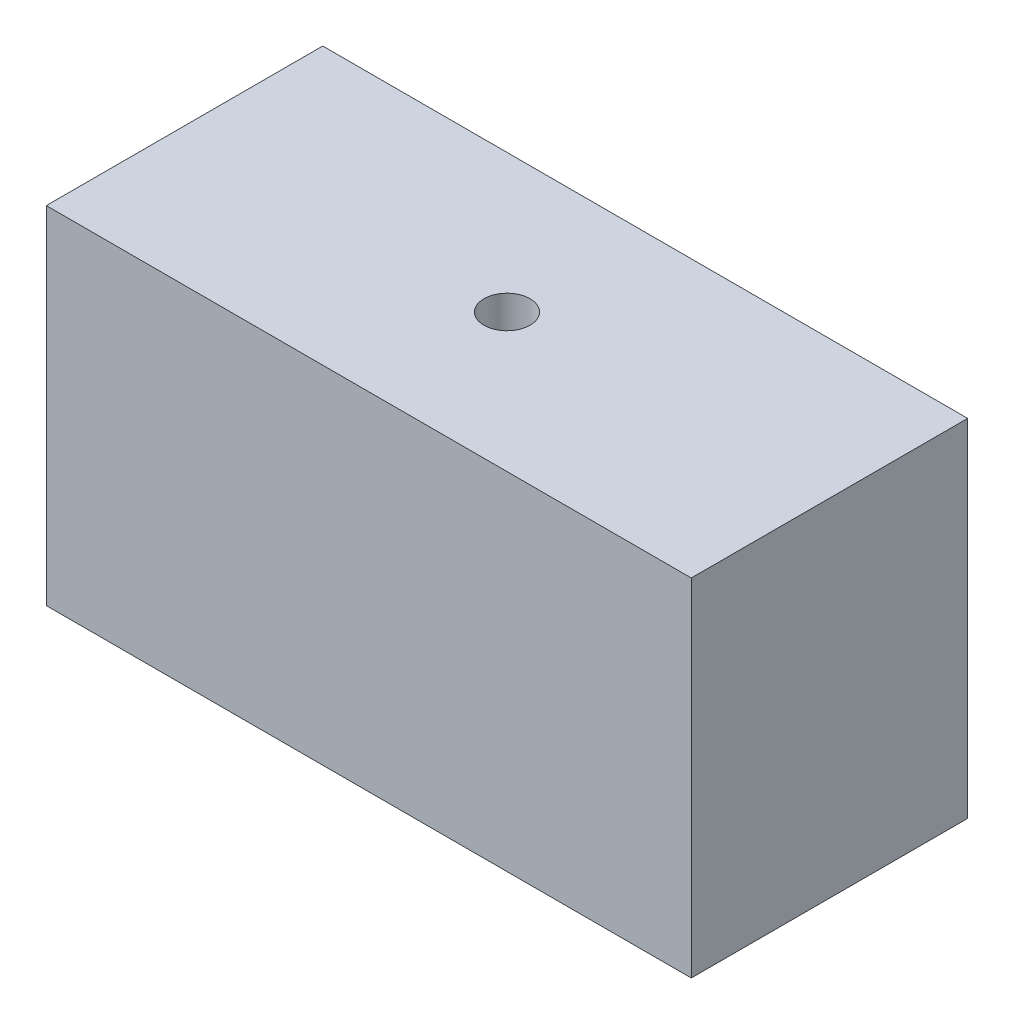
ISO-10303-21;
HEADER;
FILE_DESCRIPTION(('STEP AP214'),'2;1');
FILE_NAME('part.step','',(''),(''),'','','');
FILE_SCHEMA(('AUTOMOTIVE_DESIGN { 1 0 10303 214 1 1 1 1 }'));
ENDSEC;
DATA;
#1=APPLICATION_CONTEXT('core data for automotive mechanical design processes');
#2=APPLICATION_PROTOCOL_DEFINITION('international standard','automotive_design',2000,#1);
#3=PRODUCT_CONTEXT('',#1,'mechanical');
#4=PRODUCT('Part','Part','',(#3));
#5=PRODUCT_RELATED_PRODUCT_CATEGORY('part','',(#4));
#6=PRODUCT_DEFINITION_FORMATION('','',#4);
#7=PRODUCT_DEFINITION_CONTEXT('part definition',#1,'design');
#8=PRODUCT_DEFINITION('design','',#6,#7);
#9=PRODUCT_DEFINITION_SHAPE('','',#8);
#10=(LENGTH_UNIT() NAMED_UNIT(*) SI_UNIT(.MILLI.,.METRE.));
#11=(NAMED_UNIT(*) PLANE_ANGLE_UNIT() SI_UNIT($,.RADIAN.));
#12=(NAMED_UNIT(*) SI_UNIT($,.STERADIAN.) SOLID_ANGLE_UNIT());
#13=UNCERTAINTY_MEASURE_WITH_UNIT(LENGTH_MEASURE(1.E-05),#10,'distance_accuracy_value','');
#14=(GEOMETRIC_REPRESENTATION_CONTEXT(3) GLOBAL_UNCERTAINTY_ASSIGNED_CONTEXT((#13)) GLOBAL_UNIT_ASSIGNED_CONTEXT((#10,
#11,#12)) REPRESENTATION_CONTEXT('',''));
#15=CARTESIAN_POINT('',(0.,0.,0.));
#16=DIRECTION('',(0.,0.,1.));
#17=DIRECTION('',(1.,0.,0.));
#18=AXIS2_PLACEMENT_3D('',#15,#16,#17);
#19=CARTESIAN_POINT('',(0.,47.752,0.));
#20=DIRECTION('',(0.,-1.,0.));
#21=DIRECTION('',(0.,0.,-1.));
#22=AXIS2_PLACEMENT_3D('',#19,#20,#21);
#23=PLANE('',#22);
#24=DIRECTION('',(0.,0.,1.));
#25=VECTOR('',#24,1.);
#26=CARTESIAN_POINT('',(0.,47.752,0.));
#27=LINE('',#26,#25);
#28=CARTESIAN_POINT('',(0.,47.752,-38.1));
#29=VERTEX_POINT('',#28);
#30=CARTESIAN_POINT('',(0.,47.752,0.));
#31=VERTEX_POINT('',#30);
#32=EDGE_CURVE('E92',#29,#31,#27,.T.);
#33=ORIENTED_EDGE('',*,*,#32,.T.);
#34=DIRECTION('',(1.,0.,0.));
#35=VECTOR('',#34,1.);
#36=CARTESIAN_POINT('',(0.,47.752,0.));
#37=LINE('',#36,#35);
#38=CARTESIAN_POINT('',(88.9,47.752,0.));
#39=VERTEX_POINT('',#38);
#40=EDGE_CURVE('E87',#31,#39,#37,.T.);
#41=ORIENTED_EDGE('',*,*,#40,.T.);
#42=DIRECTION('',(0.,0.,-1.));
#43=VECTOR('',#42,1.);
#44=CARTESIAN_POINT('',(88.9,47.752,0.));
#45=LINE('',#44,#43);
#46=CARTESIAN_POINT('',(88.9,47.752,-38.1));
#47=VERTEX_POINT('',#46);
#48=EDGE_CURVE('E90',#39,#47,#45,.T.);
#49=ORIENTED_EDGE('',*,*,#48,.T.);
#50=DIRECTION('',(-1.,0.,0.));
#51=VECTOR('',#50,1.);
#52=CARTESIAN_POINT('',(0.,47.752,-38.1));
#53=LINE('',#52,#51);
#54=EDGE_CURVE('E57',#47,#29,#53,.T.);
#55=ORIENTED_EDGE('',*,*,#54,.T.);
#56=EDGE_LOOP('',(#33,#41,#49,#55));
#57=FACE_BOUND('',#56,.T.);
#58=CARTESIAN_POINT('',(44.45,47.752,-19.05));
#59=DIRECTION('',(0.,1.,0.));
#60=DIRECTION('',(0.,0.,1.));
#61=AXIS2_PLACEMENT_3D('',#58,#59,#60);
#62=CIRCLE('',#61,3.175);
#63=CARTESIAN_POINT('',(44.45,47.752,-15.875));
#64=VERTEX_POINT('',#63);
#65=EDGE_CURVE('E112',#64,#64,#62,.T.);
#66=ORIENTED_EDGE('',*,*,#65,.F.);
#67=EDGE_LOOP('',(#66));
#68=FACE_BOUND('',#67,.T.);
#69=ADVANCED_FACE('F39',(#57,#68),#23,.F.);
#70=CARTESIAN_POINT('',(0.,0.,0.));
#71=DIRECTION('',(0.,-1.,0.));
#72=DIRECTION('',(0.,0.,-1.));
#73=AXIS2_PLACEMENT_3D('',#70,#71,#72);
#74=PLANE('',#73);
#75=DIRECTION('',(0.,0.,1.));
#76=VECTOR('',#75,1.);
#77=CARTESIAN_POINT('',(0.,0.,0.));
#78=LINE('',#77,#76);
#79=CARTESIAN_POINT('',(0.,0.,-38.1));
#80=VERTEX_POINT('',#79);
#81=CARTESIAN_POINT('',(0.,0.,0.));
#82=VERTEX_POINT('',#81);
#83=EDGE_CURVE('E108',#80,#82,#78,.T.);
#84=ORIENTED_EDGE('',*,*,#83,.F.);
#85=DIRECTION('',(-1.,0.,0.));
#86=VECTOR('',#85,1.);
#87=CARTESIAN_POINT('',(0.,0.,-38.1));
#88=LINE('',#87,#86);
#89=CARTESIAN_POINT('',(88.9,0.,-38.1));
#90=VERTEX_POINT('',#89);
#91=EDGE_CURVE('E80',#90,#80,#88,.T.);
#92=ORIENTED_EDGE('',*,*,#91,.F.);
#93=DIRECTION('',(0.,0.,-1.));
#94=VECTOR('',#93,1.);
#95=CARTESIAN_POINT('',(88.9,0.,0.));
#96=LINE('',#95,#94);
#97=CARTESIAN_POINT('',(88.9,0.,0.));
#98=VERTEX_POINT('',#97);
#99=EDGE_CURVE('E74',#98,#90,#96,.T.);
#100=ORIENTED_EDGE('',*,*,#99,.F.);
#101=DIRECTION('',(1.,0.,0.));
#102=VECTOR('',#101,1.);
#103=CARTESIAN_POINT('',(0.,0.,0.));
#104=LINE('',#103,#102);
#105=EDGE_CURVE('E97',#82,#98,#104,.T.);
#106=ORIENTED_EDGE('',*,*,#105,.F.);
#107=EDGE_LOOP('',(#84,#92,#100,#106));
#108=FACE_BOUND('',#107,.T.);
#109=CARTESIAN_POINT('',(44.45,0.,-19.05));
#110=DIRECTION('',(0.,1.,0.));
#111=DIRECTION('',(0.,0.,1.));
#112=AXIS2_PLACEMENT_3D('',#109,#110,#111);
#113=CIRCLE('',#112,3.175);
#114=CARTESIAN_POINT('',(44.45,0.,-15.875));
#115=VERTEX_POINT('',#114);
#116=EDGE_CURVE('E130',#115,#115,#113,.T.);
#117=ORIENTED_EDGE('',*,*,#116,.T.);
#118=EDGE_LOOP('',(#117));
#119=FACE_BOUND('',#118,.T.);
#120=ADVANCED_FACE('F125',(#108,#119),#74,.T.);
#121=CARTESIAN_POINT('',(0.,47.752,0.));
#122=DIRECTION('',(1.,0.,0.));
#123=DIRECTION('',(0.,0.,-1.));
#124=AXIS2_PLACEMENT_3D('',#121,#122,#123);
#125=PLANE('',#124);
#126=ORIENTED_EDGE('',*,*,#83,.T.);
#127=DIRECTION('',(0.,-1.,0.));
#128=VECTOR('',#127,1.);
#129=CARTESIAN_POINT('',(0.,47.752,0.));
#130=LINE('',#129,#128);
#131=EDGE_CURVE('E11',#31,#82,#130,.T.);
#132=ORIENTED_EDGE('',*,*,#131,.F.);
#133=ORIENTED_EDGE('',*,*,#32,.F.);
#134=DIRECTION('',(0.,-1.,0.));
#135=VECTOR('',#134,1.);
#136=CARTESIAN_POINT('',(0.,47.752,-38.1));
#137=LINE('',#136,#135);
#138=EDGE_CURVE('E104',#29,#80,#137,.T.);
#139=ORIENTED_EDGE('',*,*,#138,.T.);
#140=EDGE_LOOP('',(#126,#132,#133,#139));
#141=FACE_BOUND('',#140,.T.);
#142=ADVANCED_FACE('F41',(#141),#125,.F.);
#143=CARTESIAN_POINT('',(0.,47.752,0.));
#144=DIRECTION('',(0.,0.,-1.));
#145=DIRECTION('',(-1.,0.,0.));
#146=AXIS2_PLACEMENT_3D('',#143,#144,#145);
#147=PLANE('',#146);
#148=ORIENTED_EDGE('',*,*,#105,.T.);
#149=DIRECTION('',(0.,-1.,0.));
#150=VECTOR('',#149,1.);
#151=CARTESIAN_POINT('',(88.9,47.752,0.));
#152=LINE('',#151,#150);
#153=EDGE_CURVE('E49',#39,#98,#152,.T.);
#154=ORIENTED_EDGE('',*,*,#153,.F.);
#155=ORIENTED_EDGE('',*,*,#40,.F.);
#156=ORIENTED_EDGE('',*,*,#131,.T.);
#157=EDGE_LOOP('',(#148,#154,#155,#156));
#158=FACE_BOUND('',#157,.T.);
#159=ADVANCED_FACE('F96',(#158),#147,.F.);
#160=CARTESIAN_POINT('',(88.9,47.752,0.));
#161=DIRECTION('',(-1.,0.,0.));
#162=DIRECTION('',(0.,0.,1.));
#163=AXIS2_PLACEMENT_3D('',#160,#161,#162);
#164=PLANE('',#163);
#165=ORIENTED_EDGE('',*,*,#99,.T.);
#166=DIRECTION('',(0.,-1.,0.));
#167=VECTOR('',#166,1.);
#168=CARTESIAN_POINT('',(88.9,47.752,-38.1));
#169=LINE('',#168,#167);
#170=EDGE_CURVE('E99',#47,#90,#169,.T.);
#171=ORIENTED_EDGE('',*,*,#170,.F.);
#172=ORIENTED_EDGE('',*,*,#48,.F.);
#173=ORIENTED_EDGE('',*,*,#153,.T.);
#174=EDGE_LOOP('',(#165,#171,#172,#173));
#175=FACE_BOUND('',#174,.T.);
#176=ADVANCED_FACE('F100',(#175),#164,.F.);
#177=CARTESIAN_POINT('',(0.,47.752,-38.1));
#178=DIRECTION('',(0.,0.,1.));
#179=DIRECTION('',(1.,0.,0.));
#180=AXIS2_PLACEMENT_3D('',#177,#178,#179);
#181=PLANE('',#180);
#182=ORIENTED_EDGE('',*,*,#91,.T.);
#183=ORIENTED_EDGE('',*,*,#138,.F.);
#184=ORIENTED_EDGE('',*,*,#54,.F.);
#185=ORIENTED_EDGE('',*,*,#170,.T.);
#186=EDGE_LOOP('',(#182,#183,#184,#185));
#187=FACE_BOUND('',#186,.T.);
#188=ADVANCED_FACE('F122',(#187),#181,.F.);
#189=CARTESIAN_POINT('',(44.45,47.752,-19.05));
#190=DIRECTION('',(0.,-1.,0.));
#191=DIRECTION('',(0.,0.,-1.));
#192=AXIS2_PLACEMENT_3D('',#189,#190,#191);
#193=CYLINDRICAL_SURFACE('',#192,3.175);
#194=ORIENTED_EDGE('',*,*,#65,.T.);
#195=EDGE_LOOP('',(#194));
#196=FACE_BOUND('',#195,.T.);
#197=ORIENTED_EDGE('',*,*,#116,.F.);
#198=EDGE_LOOP('',(#197));
#199=FACE_BOUND('',#198,.T.);
#200=ADVANCED_FACE('F138',(#196,#199),#193,.F.);
#201=CLOSED_SHELL('',(#69,#120,#142,#159,#176,#188,#200));
#202=MANIFOLD_SOLID_BREP('B2',#201);
#203=ADVANCED_BREP_SHAPE_REPRESENTATION('',(#18,#202),#14);
#204=SHAPE_DEFINITION_REPRESENTATION(#9,#203);
ENDSEC;
END-ISO-10303-21;
